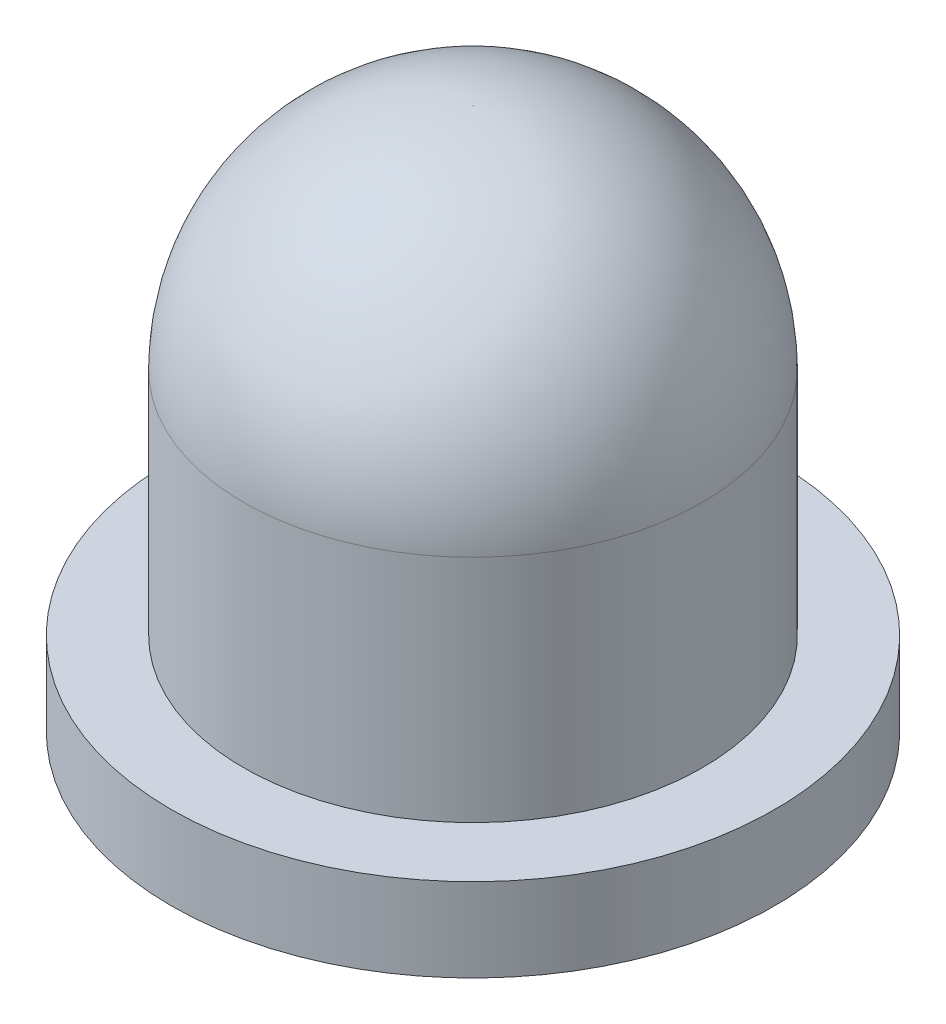
ISO-10303-21;
HEADER;
FILE_DESCRIPTION(('STEP AP214'),'2;1');
FILE_NAME('part.step','',(''),(''),'','','');
FILE_SCHEMA(('AUTOMOTIVE_DESIGN { 1 0 10303 214 1 1 1 1 }'));
ENDSEC;
DATA;
#1=APPLICATION_CONTEXT('core data for automotive mechanical design processes');
#2=APPLICATION_PROTOCOL_DEFINITION('international standard','automotive_design',2000,#1);
#3=PRODUCT_CONTEXT('',#1,'mechanical');
#4=PRODUCT('Part','Part','',(#3));
#5=PRODUCT_RELATED_PRODUCT_CATEGORY('part','',(#4));
#6=PRODUCT_DEFINITION_FORMATION('','',#4);
#7=PRODUCT_DEFINITION_CONTEXT('part definition',#1,'design');
#8=PRODUCT_DEFINITION('design','',#6,#7);
#9=PRODUCT_DEFINITION_SHAPE('','',#8);
#10=(LENGTH_UNIT() NAMED_UNIT(*) SI_UNIT(.MILLI.,.METRE.));
#11=(NAMED_UNIT(*) PLANE_ANGLE_UNIT() SI_UNIT($,.RADIAN.));
#12=(NAMED_UNIT(*) SI_UNIT($,.STERADIAN.) SOLID_ANGLE_UNIT());
#13=UNCERTAINTY_MEASURE_WITH_UNIT(LENGTH_MEASURE(1.E-05),#10,'distance_accuracy_value','');
#14=(GEOMETRIC_REPRESENTATION_CONTEXT(3) GLOBAL_UNCERTAINTY_ASSIGNED_CONTEXT((#13)) GLOBAL_UNIT_ASSIGNED_CONTEXT((#10,
#11,#12)) REPRESENTATION_CONTEXT('',''));
#15=CARTESIAN_POINT('',(0.,0.,0.));
#16=DIRECTION('',(0.,0.,1.));
#17=DIRECTION('',(1.,0.,0.));
#18=AXIS2_PLACEMENT_3D('',#15,#16,#17);
#19=CARTESIAN_POINT('',(-2.75,-5.50000000000001,0.));
#20=DIRECTION('',(0.,-1.,0.));
#21=DIRECTION('',(0.,0.,-1.));
#22=AXIS2_PLACEMENT_3D('',#19,#20,#21);
#23=CYLINDRICAL_SURFACE('',#22,5.5);
#24=CARTESIAN_POINT('',(-2.75,0.00999999999995449,0.));
#25=DIRECTION('',(0.,-1.,0.));
#26=DIRECTION('',(0.,0.,-1.));
#27=AXIS2_PLACEMENT_3D('',#24,#25,#26);
#28=CIRCLE('',#27,5.5);
#29=CARTESIAN_POINT('',(-2.75,0.00999999999995449,-5.5));
#30=VERTEX_POINT('',#29);
#31=EDGE_CURVE('E12',#30,#30,#28,.T.);
#32=ORIENTED_EDGE('',*,*,#31,.T.);
#33=EDGE_LOOP('',(#32));
#34=FACE_BOUND('',#33,.T.);
#35=CARTESIAN_POINT('',(-2.75,-5.50000000000001,0.));
#36=DIRECTION('',(0.,-1.,0.));
#37=DIRECTION('',(0.,0.,-1.));
#38=AXIS2_PLACEMENT_3D('',#35,#36,#37);
#39=CIRCLE('',#38,5.5);
#40=CARTESIAN_POINT('',(-2.75,-5.50000000000001,-5.5));
#41=VERTEX_POINT('',#40);
#42=EDGE_CURVE('E54',#41,#41,#39,.T.);
#43=ORIENTED_EDGE('',*,*,#42,.F.);
#44=EDGE_LOOP('',(#43));
#45=FACE_BOUND('',#44,.T.);
#46=ADVANCED_FACE('F44',(#34,#45),#23,.T.);
#47=CARTESIAN_POINT('',(-2.75,0.01000000000001,0.));
#48=DIRECTION('',(0.,-1.,0.));
#49=DIRECTION('',(0.,0.,-1.));
#50=AXIS2_PLACEMENT_3D('',#47,#48,#49);
#51=DEGENERATE_TOROIDAL_SURFACE('',#50,0.00999999999999873,5.49,.T.);
#52=CARTESIAN_POINT('',(-2.75,5.50000000000001,0.));
#53=DIRECTION('',(0.,-1.,0.));
#54=DIRECTION('',(0.,0.,-1.));
#55=AXIS2_PLACEMENT_3D('',#52,#53,#54);
#56=CIRCLE('',#55,0.00999999999996056);
#57=CARTESIAN_POINT('',(-2.75,5.50000000000001,-0.00999999999996056));
#58=VERTEX_POINT('',#57);
#59=EDGE_CURVE('E50',#58,#58,#56,.T.);
#60=ORIENTED_EDGE('',*,*,#59,.T.);
#61=EDGE_LOOP('',(#60));
#62=FACE_BOUND('',#61,.T.);
#63=ORIENTED_EDGE('',*,*,#31,.F.);
#64=EDGE_LOOP('',(#63));
#65=FACE_BOUND('',#64,.T.);
#66=ADVANCED_FACE('F85',(#62,#65),#51,.T.);
#67=CARTESIAN_POINT('',(0.,5.50000000000001,0.));
#68=DIRECTION('',(0.,1.,0.));
#69=DIRECTION('',(0.,0.,1.));
#70=AXIS2_PLACEMENT_3D('',#67,#68,#69);
#71=PLANE('',#70);
#72=ORIENTED_EDGE('',*,*,#59,.F.);
#73=EDGE_LOOP('',(#72));
#74=FACE_BOUND('',#73,.T.);
#75=ADVANCED_FACE('F72',(#74),#71,.T.);
#76=CARTESIAN_POINT('',(-2.75,-7.50000000000001,0.));
#77=DIRECTION('',(0.,1.,0.));
#78=DIRECTION('',(0.,0.,1.));
#79=AXIS2_PLACEMENT_3D('',#76,#77,#78);
#80=CYLINDRICAL_SURFACE('',#79,7.23437670810359);
#81=CARTESIAN_POINT('',(-2.75,-7.50000000000001,0.));
#82=DIRECTION('',(0.,-1.,0.));
#83=DIRECTION('',(0.,0.,-1.));
#84=AXIS2_PLACEMENT_3D('',#81,#82,#83);
#85=CIRCLE('',#84,7.23437670810359);
#86=CARTESIAN_POINT('',(-2.75,-7.50000000000001,-7.23437670810359));
#87=VERTEX_POINT('',#86);
#88=EDGE_CURVE('E58',#87,#87,#85,.T.);
#89=ORIENTED_EDGE('',*,*,#88,.F.);
#90=EDGE_LOOP('',(#89));
#91=FACE_BOUND('',#90,.T.);
#92=CARTESIAN_POINT('',(-2.75,-5.50000000000001,0.));
#93=DIRECTION('',(0.,-1.,0.));
#94=DIRECTION('',(0.,0.,-1.));
#95=AXIS2_PLACEMENT_3D('',#92,#93,#94);
#96=CIRCLE('',#95,7.23437670810359);
#97=CARTESIAN_POINT('',(-2.75,-5.50000000000001,-7.23437670810359));
#98=VERTEX_POINT('',#97);
#99=EDGE_CURVE('E61',#98,#98,#96,.T.);
#100=ORIENTED_EDGE('',*,*,#99,.T.);
#101=EDGE_LOOP('',(#100));
#102=FACE_BOUND('',#101,.T.);
#103=ADVANCED_FACE('F69',(#91,#102),#80,.T.);
#104=CARTESIAN_POINT('',(-2.75,-7.50000000000001,0.));
#105=DIRECTION('',(0.,-1.,0.));
#106=DIRECTION('',(0.,0.,-1.));
#107=AXIS2_PLACEMENT_3D('',#104,#105,#106);
#108=PLANE('',#107);
#109=ORIENTED_EDGE('',*,*,#88,.T.);
#110=EDGE_LOOP('',(#109));
#111=FACE_BOUND('',#110,.T.);
#112=ADVANCED_FACE('F67',(#111),#108,.T.);
#113=CARTESIAN_POINT('',(-2.75,-5.50000000000001,0.));
#114=DIRECTION('',(0.,-1.,0.));
#115=DIRECTION('',(0.,0.,-1.));
#116=AXIS2_PLACEMENT_3D('',#113,#114,#115);
#117=PLANE('',#116);
#118=ORIENTED_EDGE('',*,*,#42,.T.);
#119=EDGE_LOOP('',(#118));
#120=FACE_BOUND('',#119,.T.);
#121=ORIENTED_EDGE('',*,*,#99,.F.);
#122=EDGE_LOOP('',(#121));
#123=FACE_BOUND('',#122,.T.);
#124=ADVANCED_FACE('F76',(#120,#123),#117,.F.);
#125=CLOSED_SHELL('',(#46,#66,#75,#103,#112,#124));
#126=MANIFOLD_SOLID_BREP('B2',#125);
#127=ADVANCED_BREP_SHAPE_REPRESENTATION('',(#18,#126),#14);
#128=SHAPE_DEFINITION_REPRESENTATION(#9,#127);
ENDSEC;
END-ISO-10303-21;
